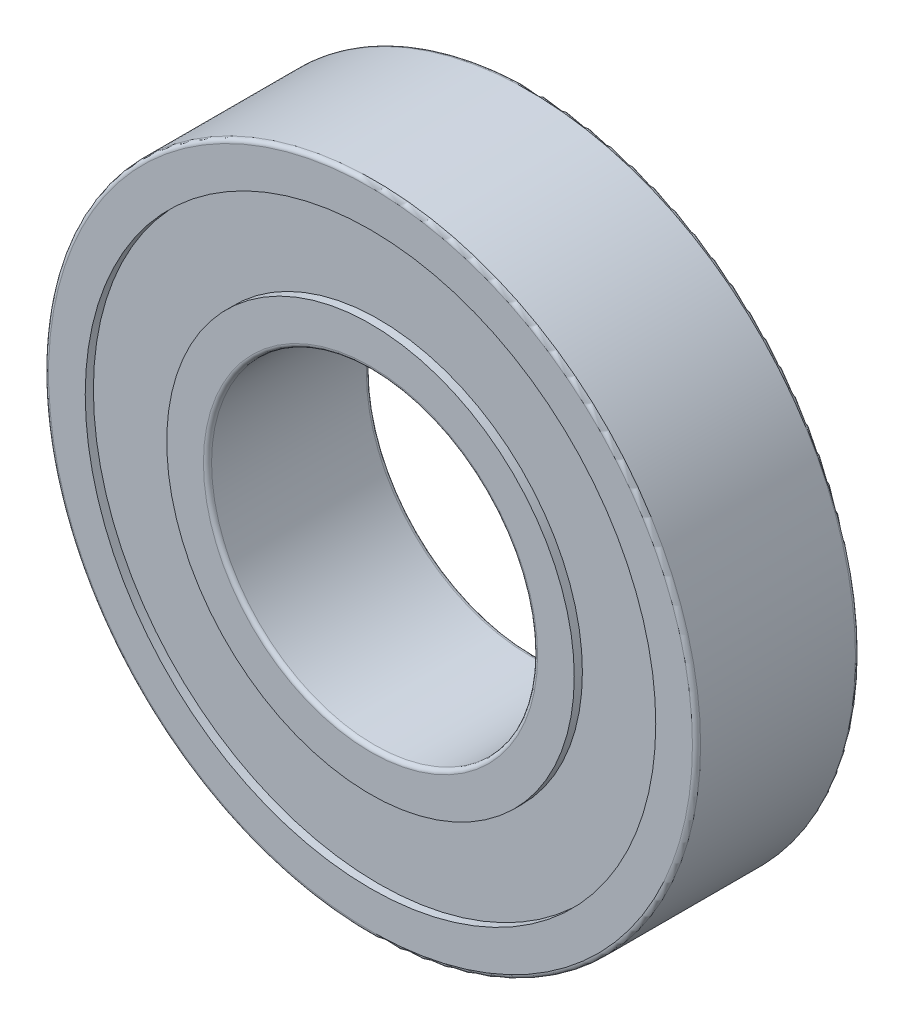
ISO-10303-21;
HEADER;
FILE_DESCRIPTION(('STEP AP214'),'2;1');
FILE_NAME('part.step','',(''),(''),'','','');
FILE_SCHEMA(('AUTOMOTIVE_DESIGN { 1 0 10303 214 1 1 1 1 }'));
ENDSEC;
DATA;
#1=APPLICATION_CONTEXT('core data for automotive mechanical design processes');
#2=APPLICATION_PROTOCOL_DEFINITION('international standard','automotive_design',2000,#1);
#3=PRODUCT_CONTEXT('',#1,'mechanical');
#4=PRODUCT('Part','Part','',(#3));
#5=PRODUCT_RELATED_PRODUCT_CATEGORY('part','',(#4));
#6=PRODUCT_DEFINITION_FORMATION('','',#4);
#7=PRODUCT_DEFINITION_CONTEXT('part definition',#1,'design');
#8=PRODUCT_DEFINITION('design','',#6,#7);
#9=PRODUCT_DEFINITION_SHAPE('','',#8);
#10=(LENGTH_UNIT() NAMED_UNIT(*) SI_UNIT(.MILLI.,.METRE.));
#11=(NAMED_UNIT(*) PLANE_ANGLE_UNIT() SI_UNIT($,.RADIAN.));
#12=(NAMED_UNIT(*) SI_UNIT($,.STERADIAN.) SOLID_ANGLE_UNIT());
#13=UNCERTAINTY_MEASURE_WITH_UNIT(LENGTH_MEASURE(1.E-05),#10,'distance_accuracy_value','');
#14=(GEOMETRIC_REPRESENTATION_CONTEXT(3) GLOBAL_UNCERTAINTY_ASSIGNED_CONTEXT((#13)) GLOBAL_UNIT_ASSIGNED_CONTEXT((#10,
#11,#12)) REPRESENTATION_CONTEXT('',''));
#15=CARTESIAN_POINT('',(0.,0.,0.));
#16=DIRECTION('',(0.,0.,1.));
#17=DIRECTION('',(1.,0.,0.));
#18=AXIS2_PLACEMENT_3D('',#15,#16,#17);
#19=CARTESIAN_POINT('',(0.,0.,0.));
#20=DIRECTION('',(0.,0.,1.));
#21=DIRECTION('',(1.,0.,0.));
#22=AXIS2_PLACEMENT_3D('',#19,#20,#21);
#23=PLANE('',#22);
#24=CARTESIAN_POINT('',(0.,0.,0.));
#25=DIRECTION('',(0.,0.,1.));
#26=DIRECTION('',(1.,0.,0.));
#27=AXIS2_PLACEMENT_3D('',#24,#25,#26);
#28=CIRCLE('',#27,6.15);
#29=CARTESIAN_POINT('',(6.15,0.,0.));
#30=VERTEX_POINT('',#29);
#31=EDGE_CURVE('E66',#30,#30,#28,.T.);
#32=ORIENTED_EDGE('',*,*,#31,.T.);
#33=EDGE_LOOP('',(#32));
#34=FACE_BOUND('',#33,.T.);
#35=CARTESIAN_POINT('',(0.,0.,0.));
#36=DIRECTION('',(0.,0.,1.));
#37=DIRECTION('',(1.,0.,0.));
#38=AXIS2_PLACEMENT_3D('',#35,#36,#37);
#39=CIRCLE('',#38,7.5);
#40=CARTESIAN_POINT('',(7.5,0.,0.));
#41=VERTEX_POINT('',#40);
#42=EDGE_CURVE('E88',#41,#41,#39,.T.);
#43=ORIENTED_EDGE('',*,*,#42,.F.);
#44=EDGE_LOOP('',(#43));
#45=FACE_BOUND('',#44,.T.);
#46=ADVANCED_FACE('F37',(#34,#45),#23,.F.);
#47=CARTESIAN_POINT('',(0.,0.,6.));
#48=DIRECTION('',(0.,0.,1.));
#49=DIRECTION('',(1.,0.,0.));
#50=AXIS2_PLACEMENT_3D('',#47,#48,#49);
#51=PLANE('',#50);
#52=CARTESIAN_POINT('',(0.,0.,6.));
#53=DIRECTION('',(0.,0.,1.));
#54=DIRECTION('',(1.,0.,0.));
#55=AXIS2_PLACEMENT_3D('',#52,#53,#54);
#56=CIRCLE('',#55,6.15);
#57=CARTESIAN_POINT('',(6.15,0.,6.));
#58=VERTEX_POINT('',#57);
#59=EDGE_CURVE('E44',#58,#58,#56,.F.);
#60=ORIENTED_EDGE('',*,*,#59,.T.);
#61=EDGE_LOOP('',(#60));
#62=FACE_BOUND('',#61,.T.);
#63=CARTESIAN_POINT('',(0.,0.,6.));
#64=DIRECTION('',(0.,0.,1.));
#65=DIRECTION('',(1.,0.,0.));
#66=AXIS2_PLACEMENT_3D('',#63,#64,#65);
#67=CIRCLE('',#66,7.5);
#68=CARTESIAN_POINT('',(7.5,0.,6.));
#69=VERTEX_POINT('',#68);
#70=EDGE_CURVE('E76',#69,#69,#67,.T.);
#71=ORIENTED_EDGE('',*,*,#70,.T.);
#72=EDGE_LOOP('',(#71));
#73=FACE_BOUND('',#72,.T.);
#74=ADVANCED_FACE('F105',(#62,#73),#51,.T.);
#75=CARTESIAN_POINT('',(0.,0.,6.));
#76=DIRECTION('',(0.,0.,1.));
#77=DIRECTION('',(1.,0.,0.));
#78=AXIS2_PLACEMENT_3D('',#75,#76,#77);
#79=CIRCLE('',#78,11.85);
#80=CARTESIAN_POINT('',(11.85,0.,6.));
#81=VERTEX_POINT('',#80);
#82=EDGE_CURVE('E10',#81,#81,#79,.T.);
#83=ORIENTED_EDGE('',*,*,#82,.T.);
#84=EDGE_LOOP('',(#83));
#85=FACE_BOUND('',#84,.T.);
#86=CARTESIAN_POINT('',(0.,0.,6.));
#87=DIRECTION('',(0.,0.,1.));
#88=DIRECTION('',(1.,0.,0.));
#89=AXIS2_PLACEMENT_3D('',#86,#87,#88);
#90=CIRCLE('',#89,10.5);
#91=CARTESIAN_POINT('',(10.5,0.,6.));
#92=VERTEX_POINT('',#91);
#93=EDGE_CURVE('E70',#92,#92,#90,.T.);
#94=ORIENTED_EDGE('',*,*,#93,.F.);
#95=EDGE_LOOP('',(#94));
#96=FACE_BOUND('',#95,.T.);
#97=ADVANCED_FACE('F112',(#85,#96),#51,.T.);
#98=CARTESIAN_POINT('',(0.,0.,0.));
#99=DIRECTION('',(0.,0.,1.));
#100=DIRECTION('',(1.,0.,0.));
#101=AXIS2_PLACEMENT_3D('',#98,#99,#100);
#102=CIRCLE('',#101,11.85);
#103=CARTESIAN_POINT('',(11.85,0.,0.));
#104=VERTEX_POINT('',#103);
#105=EDGE_CURVE('E48',#104,#104,#102,.F.);
#106=ORIENTED_EDGE('',*,*,#105,.T.);
#107=EDGE_LOOP('',(#106));
#108=FACE_BOUND('',#107,.T.);
#109=CARTESIAN_POINT('',(0.,0.,0.));
#110=DIRECTION('',(0.,0.,1.));
#111=DIRECTION('',(1.,0.,0.));
#112=AXIS2_PLACEMENT_3D('',#109,#110,#111);
#113=CIRCLE('',#112,10.5);
#114=CARTESIAN_POINT('',(10.5,0.,0.));
#115=VERTEX_POINT('',#114);
#116=EDGE_CURVE('E82',#115,#115,#113,.T.);
#117=ORIENTED_EDGE('',*,*,#116,.T.);
#118=EDGE_LOOP('',(#117));
#119=FACE_BOUND('',#118,.T.);
#120=ADVANCED_FACE('F108',(#108,#119),#23,.F.);
#121=CARTESIAN_POINT('',(0.,0.,6.));
#122=DIRECTION('',(0.,0.,-1.));
#123=DIRECTION('',(-1.,0.,0.));
#124=AXIS2_PLACEMENT_3D('',#121,#122,#123);
#125=CYLINDRICAL_SURFACE('',#124,12.);
#126=CARTESIAN_POINT('',(0.,0.,0.15));
#127=DIRECTION('',(0.,0.,1.));
#128=DIRECTION('',(1.,0.,0.));
#129=AXIS2_PLACEMENT_3D('',#126,#127,#128);
#130=CIRCLE('',#129,12.);
#131=CARTESIAN_POINT('',(12.,0.,0.15));
#132=VERTEX_POINT('',#131);
#133=EDGE_CURVE('E52',#132,#132,#130,.T.);
#134=ORIENTED_EDGE('',*,*,#133,.T.);
#135=EDGE_LOOP('',(#134));
#136=FACE_BOUND('',#135,.T.);
#137=CARTESIAN_POINT('',(0.,0.,5.85));
#138=DIRECTION('',(0.,0.,1.));
#139=DIRECTION('',(1.,0.,0.));
#140=AXIS2_PLACEMENT_3D('',#137,#138,#139);
#141=CIRCLE('',#140,12.);
#142=CARTESIAN_POINT('',(12.,0.,5.85));
#143=VERTEX_POINT('',#142);
#144=EDGE_CURVE('E57',#143,#143,#141,.F.);
#145=ORIENTED_EDGE('',*,*,#144,.T.);
#146=EDGE_LOOP('',(#145));
#147=FACE_BOUND('',#146,.T.);
#148=ADVANCED_FACE('F116',(#136,#147),#125,.T.);
#149=CARTESIAN_POINT('',(0.,0.,6.));
#150=DIRECTION('',(0.,0.,-1.));
#151=DIRECTION('',(-1.,0.,0.));
#152=AXIS2_PLACEMENT_3D('',#149,#150,#151);
#153=CYLINDRICAL_SURFACE('',#152,6.);
#154=CARTESIAN_POINT('',(0.,0.,0.15));
#155=DIRECTION('',(0.,0.,1.));
#156=DIRECTION('',(1.,0.,0.));
#157=AXIS2_PLACEMENT_3D('',#154,#155,#156);
#158=CIRCLE('',#157,6.);
#159=CARTESIAN_POINT('',(6.,0.,0.15));
#160=VERTEX_POINT('',#159);
#161=EDGE_CURVE('E60',#160,#160,#158,.F.);
#162=ORIENTED_EDGE('',*,*,#161,.T.);
#163=EDGE_LOOP('',(#162));
#164=FACE_BOUND('',#163,.T.);
#165=CARTESIAN_POINT('',(0.,0.,5.85));
#166=DIRECTION('',(0.,0.,1.));
#167=DIRECTION('',(1.,0.,0.));
#168=AXIS2_PLACEMENT_3D('',#165,#166,#167);
#169=CIRCLE('',#168,6.);
#170=CARTESIAN_POINT('',(6.,0.,5.85));
#171=VERTEX_POINT('',#170);
#172=EDGE_CURVE('E63',#171,#171,#169,.T.);
#173=ORIENTED_EDGE('',*,*,#172,.T.);
#174=EDGE_LOOP('',(#173));
#175=FACE_BOUND('',#174,.T.);
#176=ADVANCED_FACE('F122',(#164,#175),#153,.F.);
#177=CARTESIAN_POINT('',(0.,0.,5.7));
#178=DIRECTION('',(0.,0.,1.));
#179=DIRECTION('',(1.,0.,0.));
#180=AXIS2_PLACEMENT_3D('',#177,#178,#179);
#181=CYLINDRICAL_SURFACE('',#180,10.5);
#182=CARTESIAN_POINT('',(0.,0.,5.7));
#183=DIRECTION('',(0.,0.,1.));
#184=DIRECTION('',(1.,0.,0.));
#185=AXIS2_PLACEMENT_3D('',#182,#183,#184);
#186=CIRCLE('',#185,10.5);
#187=CARTESIAN_POINT('',(10.5,0.,5.7));
#188=VERTEX_POINT('',#187);
#189=EDGE_CURVE('E69',#188,#188,#186,.T.);
#190=ORIENTED_EDGE('',*,*,#189,.F.);
#191=EDGE_LOOP('',(#190));
#192=FACE_BOUND('',#191,.T.);
#193=ORIENTED_EDGE('',*,*,#93,.T.);
#194=EDGE_LOOP('',(#193));
#195=FACE_BOUND('',#194,.T.);
#196=ADVANCED_FACE('F144',(#192,#195),#181,.F.);
#197=CARTESIAN_POINT('',(0.,0.,5.7));
#198=DIRECTION('',(0.,0.,1.));
#199=DIRECTION('',(1.,0.,0.));
#200=AXIS2_PLACEMENT_3D('',#197,#198,#199);
#201=PLANE('',#200);
#202=CARTESIAN_POINT('',(0.,0.,5.7));
#203=DIRECTION('',(0.,0.,1.));
#204=DIRECTION('',(1.,0.,0.));
#205=AXIS2_PLACEMENT_3D('',#202,#203,#204);
#206=CIRCLE('',#205,7.5);
#207=CARTESIAN_POINT('',(7.5,0.,5.7));
#208=VERTEX_POINT('',#207);
#209=EDGE_CURVE('E73',#208,#208,#206,.T.);
#210=ORIENTED_EDGE('',*,*,#209,.F.);
#211=EDGE_LOOP('',(#210));
#212=FACE_BOUND('',#211,.T.);
#213=ORIENTED_EDGE('',*,*,#189,.T.);
#214=EDGE_LOOP('',(#213));
#215=FACE_BOUND('',#214,.T.);
#216=ADVANCED_FACE('F140',(#212,#215),#201,.T.);
#217=CARTESIAN_POINT('',(0.,0.,5.7));
#218=DIRECTION('',(0.,0.,1.));
#219=DIRECTION('',(1.,0.,0.));
#220=AXIS2_PLACEMENT_3D('',#217,#218,#219);
#221=CYLINDRICAL_SURFACE('',#220,7.5);
#222=ORIENTED_EDGE('',*,*,#209,.T.);
#223=EDGE_LOOP('',(#222));
#224=FACE_BOUND('',#223,.T.);
#225=ORIENTED_EDGE('',*,*,#70,.F.);
#226=EDGE_LOOP('',(#225));
#227=FACE_BOUND('',#226,.T.);
#228=ADVANCED_FACE('F134',(#224,#227),#221,.T.);
#229=CARTESIAN_POINT('',(0.,0.,0.5));
#230=DIRECTION('',(0.,0.,1.));
#231=DIRECTION('',(1.,0.,0.));
#232=AXIS2_PLACEMENT_3D('',#229,#230,#231);
#233=PLANE('',#232);
#234=CARTESIAN_POINT('',(0.,0.,0.5));
#235=DIRECTION('',(0.,0.,1.));
#236=DIRECTION('',(1.,0.,0.));
#237=AXIS2_PLACEMENT_3D('',#234,#235,#236);
#238=CIRCLE('',#237,10.5);
#239=CARTESIAN_POINT('',(10.5,0.,0.5));
#240=VERTEX_POINT('',#239);
#241=EDGE_CURVE('E79',#240,#240,#238,.T.);
#242=ORIENTED_EDGE('',*,*,#241,.F.);
#243=EDGE_LOOP('',(#242));
#244=FACE_BOUND('',#243,.T.);
#245=CARTESIAN_POINT('',(0.,0.,0.5));
#246=DIRECTION('',(0.,0.,1.));
#247=DIRECTION('',(1.,0.,0.));
#248=AXIS2_PLACEMENT_3D('',#245,#246,#247);
#249=CIRCLE('',#248,7.5);
#250=CARTESIAN_POINT('',(7.5,0.,0.5));
#251=VERTEX_POINT('',#250);
#252=EDGE_CURVE('E85',#251,#251,#249,.T.);
#253=ORIENTED_EDGE('',*,*,#252,.T.);
#254=EDGE_LOOP('',(#253));
#255=FACE_BOUND('',#254,.T.);
#256=ADVANCED_FACE('F94',(#244,#255),#233,.F.);
#257=CARTESIAN_POINT('',(0.,0.,0.5));
#258=DIRECTION('',(0.,0.,-1.));
#259=DIRECTION('',(-1.,0.,0.));
#260=AXIS2_PLACEMENT_3D('',#257,#258,#259);
#261=CYLINDRICAL_SURFACE('',#260,10.5);
#262=ORIENTED_EDGE('',*,*,#241,.T.);
#263=EDGE_LOOP('',(#262));
#264=FACE_BOUND('',#263,.T.);
#265=ORIENTED_EDGE('',*,*,#116,.F.);
#266=EDGE_LOOP('',(#265));
#267=FACE_BOUND('',#266,.T.);
#268=ADVANCED_FACE('F100',(#264,#267),#261,.F.);
#269=CARTESIAN_POINT('',(0.,0.,0.5));
#270=DIRECTION('',(0.,0.,-1.));
#271=DIRECTION('',(-1.,0.,0.));
#272=AXIS2_PLACEMENT_3D('',#269,#270,#271);
#273=CYLINDRICAL_SURFACE('',#272,7.5);
#274=ORIENTED_EDGE('',*,*,#252,.F.);
#275=EDGE_LOOP('',(#274));
#276=FACE_BOUND('',#275,.T.);
#277=ORIENTED_EDGE('',*,*,#42,.T.);
#278=EDGE_LOOP('',(#277));
#279=FACE_BOUND('',#278,.T.);
#280=ADVANCED_FACE('F96',(#276,#279),#273,.T.);
#281=CARTESIAN_POINT('',(0.,0.,0.15));
#282=DIRECTION('',(0.,0.,1.));
#283=DIRECTION('',(1.,0.,0.));
#284=AXIS2_PLACEMENT_3D('',#281,#282,#283);
#285=TOROIDAL_SURFACE('',#284,6.15,0.15);
#286=ORIENTED_EDGE('',*,*,#161,.F.);
#287=EDGE_LOOP('',(#286));
#288=FACE_BOUND('',#287,.T.);
#289=ORIENTED_EDGE('',*,*,#31,.F.);
#290=EDGE_LOOP('',(#289));
#291=FACE_BOUND('',#290,.T.);
#292=ADVANCED_FACE('F99',(#288,#291),#285,.T.);
#293=CARTESIAN_POINT('',(0.,0.,0.15));
#294=DIRECTION('',(0.,0.,1.));
#295=DIRECTION('',(1.,0.,0.));
#296=AXIS2_PLACEMENT_3D('',#293,#294,#295);
#297=TOROIDAL_SURFACE('',#296,11.85,0.15);
#298=ORIENTED_EDGE('',*,*,#105,.F.);
#299=EDGE_LOOP('',(#298));
#300=FACE_BOUND('',#299,.T.);
#301=ORIENTED_EDGE('',*,*,#133,.F.);
#302=EDGE_LOOP('',(#301));
#303=FACE_BOUND('',#302,.T.);
#304=ADVANCED_FACE('F159',(#300,#303),#297,.T.);
#305=CARTESIAN_POINT('',(0.,0.,5.85));
#306=DIRECTION('',(0.,0.,1.));
#307=DIRECTION('',(1.,0.,0.));
#308=AXIS2_PLACEMENT_3D('',#305,#306,#307);
#309=TOROIDAL_SURFACE('',#308,6.15,0.15);
#310=ORIENTED_EDGE('',*,*,#59,.F.);
#311=EDGE_LOOP('',(#310));
#312=FACE_BOUND('',#311,.T.);
#313=ORIENTED_EDGE('',*,*,#172,.F.);
#314=EDGE_LOOP('',(#313));
#315=FACE_BOUND('',#314,.T.);
#316=ADVANCED_FACE('F157',(#312,#315),#309,.T.);
#317=CARTESIAN_POINT('',(0.,0.,5.85));
#318=DIRECTION('',(0.,0.,1.));
#319=DIRECTION('',(1.,0.,0.));
#320=AXIS2_PLACEMENT_3D('',#317,#318,#319);
#321=TOROIDAL_SURFACE('',#320,11.85,0.15);
#322=ORIENTED_EDGE('',*,*,#144,.F.);
#323=EDGE_LOOP('',(#322));
#324=FACE_BOUND('',#323,.T.);
#325=ORIENTED_EDGE('',*,*,#82,.F.);
#326=EDGE_LOOP('',(#325));
#327=FACE_BOUND('',#326,.T.);
#328=ADVANCED_FACE('F39',(#324,#327),#321,.T.);
#329=CLOSED_SHELL('',(#46,#74,#97,#120,#148,#176,#196,#216,#228,#256,#268,#280,#292,#304,#316,#328));
#330=MANIFOLD_SOLID_BREP('B2',#329);
#331=ADVANCED_BREP_SHAPE_REPRESENTATION('',(#18,#330),#14);
#332=SHAPE_DEFINITION_REPRESENTATION(#9,#331);
ENDSEC;
END-ISO-10303-21;
